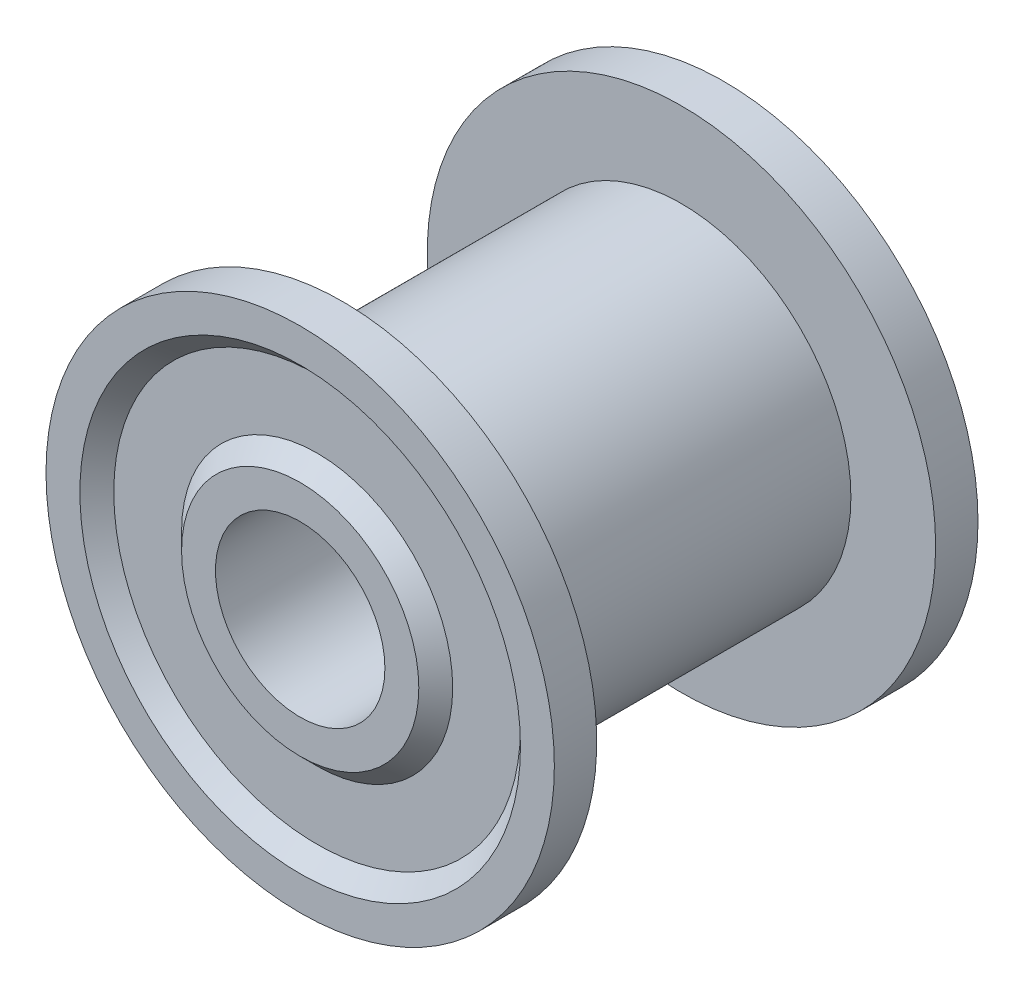
ISO-10303-21;
HEADER;
FILE_DESCRIPTION(('STEP AP214'),'2;1');
FILE_NAME('part.step','',(''),(''),'','','');
FILE_SCHEMA(('AUTOMOTIVE_DESIGN { 1 0 10303 214 1 1 1 1 }'));
ENDSEC;
DATA;
#1=APPLICATION_CONTEXT('core data for automotive mechanical design processes');
#2=APPLICATION_PROTOCOL_DEFINITION('international standard','automotive_design',2000,#1);
#3=PRODUCT_CONTEXT('',#1,'mechanical');
#4=PRODUCT('Part','Part','',(#3));
#5=PRODUCT_RELATED_PRODUCT_CATEGORY('part','',(#4));
#6=PRODUCT_DEFINITION_FORMATION('','',#4);
#7=PRODUCT_DEFINITION_CONTEXT('part definition',#1,'design');
#8=PRODUCT_DEFINITION('design','',#6,#7);
#9=PRODUCT_DEFINITION_SHAPE('','',#8);
#10=(LENGTH_UNIT() NAMED_UNIT(*) SI_UNIT(.MILLI.,.METRE.));
#11=(NAMED_UNIT(*) PLANE_ANGLE_UNIT() SI_UNIT($,.RADIAN.));
#12=(NAMED_UNIT(*) SI_UNIT($,.STERADIAN.) SOLID_ANGLE_UNIT());
#13=UNCERTAINTY_MEASURE_WITH_UNIT(LENGTH_MEASURE(1.E-05),#10,'distance_accuracy_value','');
#14=(GEOMETRIC_REPRESENTATION_CONTEXT(3) GLOBAL_UNCERTAINTY_ASSIGNED_CONTEXT((#13)) GLOBAL_UNIT_ASSIGNED_CONTEXT((#10,
#11,#12)) REPRESENTATION_CONTEXT('',''));
#15=CARTESIAN_POINT('',(0.,0.,0.));
#16=DIRECTION('',(0.,0.,1.));
#17=DIRECTION('',(1.,0.,0.));
#18=AXIS2_PLACEMENT_3D('',#15,#16,#17);
#19=CARTESIAN_POINT('',(0.,0.,0.));
#20=DIRECTION('',(0.,0.,1.));
#21=DIRECTION('',(1.,0.,0.));
#22=AXIS2_PLACEMENT_3D('',#19,#20,#21);
#23=PLANE('',#22);
#24=CARTESIAN_POINT('',(0.,0.,0.));
#25=DIRECTION('',(0.,0.,1.));
#26=DIRECTION('',(1.,0.,0.));
#27=AXIS2_PLACEMENT_3D('',#24,#25,#26);
#28=CIRCLE('',#27,5.);
#29=CARTESIAN_POINT('',(5.,0.,0.));
#30=VERTEX_POINT('',#29);
#31=EDGE_CURVE('E58',#30,#30,#28,.T.);
#32=ORIENTED_EDGE('',*,*,#31,.T.);
#33=EDGE_LOOP('',(#32));
#34=FACE_BOUND('',#33,.T.);
#35=CARTESIAN_POINT('',(0.,0.,0.));
#36=DIRECTION('',(0.,0.,1.));
#37=DIRECTION('',(1.,0.,0.));
#38=AXIS2_PLACEMENT_3D('',#35,#36,#37);
#39=CIRCLE('',#38,7.);
#40=CARTESIAN_POINT('',(7.,0.,0.));
#41=VERTEX_POINT('',#40);
#42=EDGE_CURVE('E87',#41,#41,#39,.T.);
#43=ORIENTED_EDGE('',*,*,#42,.F.);
#44=EDGE_LOOP('',(#43));
#45=FACE_BOUND('',#44,.T.);
#46=ADVANCED_FACE('F34',(#34,#45),#23,.F.);
#47=CARTESIAN_POINT('',(0.,0.,25.));
#48=DIRECTION('',(0.,0.,1.));
#49=DIRECTION('',(1.,0.,0.));
#50=AXIS2_PLACEMENT_3D('',#47,#48,#49);
#51=PLANE('',#50);
#52=CARTESIAN_POINT('',(0.,0.,25.));
#53=DIRECTION('',(0.,0.,1.));
#54=DIRECTION('',(1.,0.,0.));
#55=AXIS2_PLACEMENT_3D('',#52,#53,#54);
#56=CIRCLE('',#55,5.);
#57=CARTESIAN_POINT('',(5.,0.,25.));
#58=VERTEX_POINT('',#57);
#59=EDGE_CURVE('E66',#58,#58,#56,.T.);
#60=ORIENTED_EDGE('',*,*,#59,.F.);
#61=EDGE_LOOP('',(#60));
#62=FACE_BOUND('',#61,.T.);
#63=CARTESIAN_POINT('',(0.,0.,25.));
#64=DIRECTION('',(0.,0.,1.));
#65=DIRECTION('',(1.,0.,0.));
#66=AXIS2_PLACEMENT_3D('',#63,#64,#65);
#67=CIRCLE('',#66,7.);
#68=CARTESIAN_POINT('',(7.,0.,25.));
#69=VERTEX_POINT('',#68);
#70=EDGE_CURVE('E81',#69,#69,#67,.T.);
#71=ORIENTED_EDGE('',*,*,#70,.T.);
#72=EDGE_LOOP('',(#71));
#73=FACE_BOUND('',#72,.T.);
#74=ADVANCED_FACE('F94',(#62,#73),#51,.T.);
#75=CARTESIAN_POINT('',(0.,0.,25.));
#76=DIRECTION('',(0.,0.,-1.));
#77=DIRECTION('',(-1.,0.,0.));
#78=AXIS2_PLACEMENT_3D('',#75,#76,#77);
#79=CYLINDRICAL_SURFACE('',#78,15.);
#80=CARTESIAN_POINT('',(0.,0.,25.));
#81=DIRECTION('',(0.,0.,1.));
#82=DIRECTION('',(1.,0.,0.));
#83=AXIS2_PLACEMENT_3D('',#80,#81,#82);
#84=CIRCLE('',#83,15.);
#85=CARTESIAN_POINT('',(15.,0.,25.));
#86=VERTEX_POINT('',#85);
#87=EDGE_CURVE('E54',#86,#86,#84,.T.);
#88=ORIENTED_EDGE('',*,*,#87,.F.);
#89=EDGE_LOOP('',(#88));
#90=FACE_BOUND('',#89,.T.);
#91=CARTESIAN_POINT('',(0.,0.,22.5));
#92=DIRECTION('',(0.,0.,-1.));
#93=DIRECTION('',(-1.,0.,0.));
#94=AXIS2_PLACEMENT_3D('',#91,#92,#93);
#95=CIRCLE('',#94,15.);
#96=CARTESIAN_POINT('',(-15.,0.,22.5));
#97=VERTEX_POINT('',#96);
#98=EDGE_CURVE('E55',#97,#97,#95,.T.);
#99=ORIENTED_EDGE('',*,*,#98,.F.);
#100=EDGE_LOOP('',(#99));
#101=FACE_BOUND('',#100,.T.);
#102=ADVANCED_FACE('F101',(#90,#101),#79,.T.);
#103=CARTESIAN_POINT('',(0.,0.,0.));
#104=DIRECTION('',(0.,0.,1.));
#105=DIRECTION('',(1.,0.,0.));
#106=AXIS2_PLACEMENT_3D('',#103,#104,#105);
#107=CIRCLE('',#106,15.);
#108=CARTESIAN_POINT('',(15.,0.,0.));
#109=VERTEX_POINT('',#108);
#110=EDGE_CURVE('E63',#109,#109,#107,.T.);
#111=ORIENTED_EDGE('',*,*,#110,.T.);
#112=EDGE_LOOP('',(#111));
#113=FACE_BOUND('',#112,.T.);
#114=CARTESIAN_POINT('',(0.,0.,2.5));
#115=DIRECTION('',(0.,0.,1.));
#116=DIRECTION('',(1.,0.,0.));
#117=AXIS2_PLACEMENT_3D('',#114,#115,#116);
#118=CIRCLE('',#117,15.);
#119=CARTESIAN_POINT('',(15.,0.,2.5));
#120=VERTEX_POINT('',#119);
#121=EDGE_CURVE('E59',#120,#120,#118,.T.);
#122=ORIENTED_EDGE('',*,*,#121,.F.);
#123=EDGE_LOOP('',(#122));
#124=FACE_BOUND('',#123,.T.);
#125=ADVANCED_FACE('F116',(#113,#124),#79,.T.);
#126=CARTESIAN_POINT('',(0.,0.,25.));
#127=DIRECTION('',(0.,0.,1.));
#128=DIRECTION('',(1.,0.,0.));
#129=AXIS2_PLACEMENT_3D('',#126,#127,#128);
#130=CIRCLE('',#129,13.);
#131=CARTESIAN_POINT('',(13.,0.,25.));
#132=VERTEX_POINT('',#131);
#133=EDGE_CURVE('E78',#132,#132,#130,.T.);
#134=ORIENTED_EDGE('',*,*,#133,.F.);
#135=EDGE_LOOP('',(#134));
#136=FACE_BOUND('',#135,.T.);
#137=ORIENTED_EDGE('',*,*,#87,.T.);
#138=EDGE_LOOP('',(#137));
#139=FACE_BOUND('',#138,.T.);
#140=ADVANCED_FACE('F104',(#136,#139),#51,.T.);
#141=CARTESIAN_POINT('',(0.,0.,0.));
#142=DIRECTION('',(0.,0.,1.));
#143=DIRECTION('',(1.,0.,0.));
#144=AXIS2_PLACEMENT_3D('',#141,#142,#143);
#145=CIRCLE('',#144,13.);
#146=CARTESIAN_POINT('',(13.,0.,0.));
#147=VERTEX_POINT('',#146);
#148=EDGE_CURVE('E84',#147,#147,#145,.T.);
#149=ORIENTED_EDGE('',*,*,#148,.T.);
#150=EDGE_LOOP('',(#149));
#151=FACE_BOUND('',#150,.T.);
#152=ORIENTED_EDGE('',*,*,#110,.F.);
#153=EDGE_LOOP('',(#152));
#154=FACE_BOUND('',#153,.T.);
#155=ADVANCED_FACE('F97',(#151,#154),#23,.F.);
#156=CARTESIAN_POINT('',(0.,0.,25.));
#157=DIRECTION('',(0.,0.,-1.));
#158=DIRECTION('',(-1.,0.,0.));
#159=AXIS2_PLACEMENT_3D('',#156,#157,#158);
#160=CYLINDRICAL_SURFACE('',#159,5.);
#161=ORIENTED_EDGE('',*,*,#59,.T.);
#162=EDGE_LOOP('',(#161));
#163=FACE_BOUND('',#162,.T.);
#164=ORIENTED_EDGE('',*,*,#31,.F.);
#165=EDGE_LOOP('',(#164));
#166=FACE_BOUND('',#165,.T.);
#167=ADVANCED_FACE('F107',(#163,#166),#160,.F.);
#168=CARTESIAN_POINT('',(0.,10.,22.5));
#169=DIRECTION('',(0.,0.,-1.));
#170=DIRECTION('',(-1.,0.,0.));
#171=AXIS2_PLACEMENT_3D('',#168,#169,#170);
#172=PLANE('',#171);
#173=CARTESIAN_POINT('',(0.,0.,22.5));
#174=DIRECTION('',(0.,0.,1.));
#175=DIRECTION('',(1.,0.,0.));
#176=AXIS2_PLACEMENT_3D('',#173,#174,#175);
#177=CIRCLE('',#176,10.);
#178=CARTESIAN_POINT('',(10.,0.,22.5));
#179=VERTEX_POINT('',#178);
#180=EDGE_CURVE('E62',#179,#179,#177,.T.);
#181=ORIENTED_EDGE('',*,*,#180,.T.);
#182=EDGE_LOOP('',(#181));
#183=FACE_BOUND('',#182,.T.);
#184=ORIENTED_EDGE('',*,*,#98,.T.);
#185=EDGE_LOOP('',(#184));
#186=FACE_BOUND('',#185,.T.);
#187=ADVANCED_FACE('F113',(#183,#186),#172,.T.);
#188=CARTESIAN_POINT('',(0.,10.,2.5));
#189=DIRECTION('',(0.,0.,1.));
#190=DIRECTION('',(1.,0.,0.));
#191=AXIS2_PLACEMENT_3D('',#188,#189,#190);
#192=PLANE('',#191);
#193=CARTESIAN_POINT('',(0.,0.,2.5));
#194=DIRECTION('',(0.,0.,1.));
#195=DIRECTION('',(1.,0.,0.));
#196=AXIS2_PLACEMENT_3D('',#193,#194,#195);
#197=CIRCLE('',#196,10.);
#198=CARTESIAN_POINT('',(10.,0.,2.5));
#199=VERTEX_POINT('',#198);
#200=EDGE_CURVE('E75',#199,#199,#197,.T.);
#201=ORIENTED_EDGE('',*,*,#200,.F.);
#202=EDGE_LOOP('',(#201));
#203=FACE_BOUND('',#202,.T.);
#204=ORIENTED_EDGE('',*,*,#121,.T.);
#205=EDGE_LOOP('',(#204));
#206=FACE_BOUND('',#205,.T.);
#207=ADVANCED_FACE('F126',(#203,#206),#192,.T.);
#208=CARTESIAN_POINT('',(0.,0.,25.));
#209=DIRECTION('',(0.,0.,1.));
#210=DIRECTION('',(1.,0.,0.));
#211=AXIS2_PLACEMENT_3D('',#208,#209,#210);
#212=CYLINDRICAL_SURFACE('',#211,10.);
#213=ORIENTED_EDGE('',*,*,#200,.T.);
#214=EDGE_LOOP('',(#213));
#215=FACE_BOUND('',#214,.T.);
#216=ORIENTED_EDGE('',*,*,#180,.F.);
#217=EDGE_LOOP('',(#216));
#218=FACE_BOUND('',#217,.T.);
#219=ADVANCED_FACE('F128',(#215,#218),#212,.T.);
#220=CARTESIAN_POINT('',(0.,0.,24.));
#221=DIRECTION('',(0.,0.,1.));
#222=DIRECTION('',(1.,0.,0.));
#223=AXIS2_PLACEMENT_3D('',#220,#221,#222);
#224=PLANE('',#223);
#225=CARTESIAN_POINT('',(0.,0.,24.));
#226=DIRECTION('',(0.,0.,1.));
#227=DIRECTION('',(1.,0.,0.));
#228=AXIS2_PLACEMENT_3D('',#225,#226,#227);
#229=CIRCLE('',#228,12.);
#230=CARTESIAN_POINT('',(12.,0.,24.));
#231=VERTEX_POINT('',#230);
#232=EDGE_CURVE('E45',#231,#231,#229,.T.);
#233=ORIENTED_EDGE('',*,*,#232,.T.);
#234=EDGE_LOOP('',(#233));
#235=FACE_BOUND('',#234,.T.);
#236=CARTESIAN_POINT('',(0.,0.,24.));
#237=DIRECTION('',(0.,0.,1.));
#238=DIRECTION('',(1.,0.,0.));
#239=AXIS2_PLACEMENT_3D('',#236,#237,#238);
#240=CIRCLE('',#239,7.99999999999999);
#241=CARTESIAN_POINT('',(7.99999999999999,0.,24.));
#242=VERTEX_POINT('',#241);
#243=EDGE_CURVE('E49',#242,#242,#240,.F.);
#244=ORIENTED_EDGE('',*,*,#243,.T.);
#245=EDGE_LOOP('',(#244));
#246=FACE_BOUND('',#245,.T.);
#247=ADVANCED_FACE('F135',(#235,#246),#224,.T.);
#248=CARTESIAN_POINT('',(0.,0.,24.));
#249=DIRECTION('',(0.,0.,1.));
#250=DIRECTION('',(1.,0.,0.));
#251=AXIS2_PLACEMENT_3D('',#248,#249,#250);
#252=CONICAL_SURFACE('',#251,12.,0.785398163397449);
#253=ORIENTED_EDGE('',*,*,#133,.T.);
#254=EDGE_LOOP('',(#253));
#255=FACE_BOUND('',#254,.T.);
#256=ORIENTED_EDGE('',*,*,#232,.F.);
#257=EDGE_LOOP('',(#256));
#258=FACE_BOUND('',#257,.T.);
#259=ADVANCED_FACE('F144',(#255,#258),#252,.F.);
#260=CARTESIAN_POINT('',(0.,0.,25.));
#261=DIRECTION('',(0.,0.,-1.));
#262=DIRECTION('',(-1.,0.,0.));
#263=AXIS2_PLACEMENT_3D('',#260,#261,#262);
#264=CONICAL_SURFACE('',#263,7.,0.785398163397444);
#265=ORIENTED_EDGE('',*,*,#243,.F.);
#266=EDGE_LOOP('',(#265));
#267=FACE_BOUND('',#266,.T.);
#268=ORIENTED_EDGE('',*,*,#70,.F.);
#269=EDGE_LOOP('',(#268));
#270=FACE_BOUND('',#269,.T.);
#271=ADVANCED_FACE('F149',(#267,#270),#264,.T.);
#272=CARTESIAN_POINT('',(0.,0.,1.));
#273=DIRECTION('',(0.,0.,-1.));
#274=DIRECTION('',(1.,0.,0.));
#275=AXIS2_PLACEMENT_3D('',#272,#273,#274);
#276=PLANE('',#275);
#277=CARTESIAN_POINT('',(0.,0.,1.));
#278=DIRECTION('',(0.,0.,-1.));
#279=DIRECTION('',(-1.,0.,0.));
#280=AXIS2_PLACEMENT_3D('',#277,#278,#279);
#281=CIRCLE('',#280,12.);
#282=CARTESIAN_POINT('',(-12.,0.,1.));
#283=VERTEX_POINT('',#282);
#284=EDGE_CURVE('E10',#283,#283,#281,.T.);
#285=ORIENTED_EDGE('',*,*,#284,.T.);
#286=EDGE_LOOP('',(#285));
#287=FACE_BOUND('',#286,.T.);
#288=CARTESIAN_POINT('',(0.,0.,1.));
#289=DIRECTION('',(0.,0.,-1.));
#290=DIRECTION('',(-1.,0.,0.));
#291=AXIS2_PLACEMENT_3D('',#288,#289,#290);
#292=CIRCLE('',#291,8.00000000000002);
#293=CARTESIAN_POINT('',(-8.00000000000002,0.,1.));
#294=VERTEX_POINT('',#293);
#295=EDGE_CURVE('E41',#294,#294,#292,.F.);
#296=ORIENTED_EDGE('',*,*,#295,.T.);
#297=EDGE_LOOP('',(#296));
#298=FACE_BOUND('',#297,.T.);
#299=ADVANCED_FACE('F146',(#287,#298),#276,.T.);
#300=CARTESIAN_POINT('',(0.,0.,0.));
#301=DIRECTION('',(0.,0.,-1.));
#302=DIRECTION('',(-1.,0.,0.));
#303=AXIS2_PLACEMENT_3D('',#300,#301,#302);
#304=CONICAL_SURFACE('',#303,13.,0.785398163397443);
#305=ORIENTED_EDGE('',*,*,#284,.F.);
#306=EDGE_LOOP('',(#305));
#307=FACE_BOUND('',#306,.T.);
#308=ORIENTED_EDGE('',*,*,#148,.F.);
#309=EDGE_LOOP('',(#308));
#310=FACE_BOUND('',#309,.T.);
#311=ADVANCED_FACE('F148',(#307,#310),#304,.F.);
#312=CARTESIAN_POINT('',(0.,0.,1.));
#313=DIRECTION('',(0.,0.,1.));
#314=DIRECTION('',(1.,0.,0.));
#315=AXIS2_PLACEMENT_3D('',#312,#313,#314);
#316=CONICAL_SURFACE('',#315,8.00000000000002,0.785398163397453);
#317=ORIENTED_EDGE('',*,*,#42,.T.);
#318=EDGE_LOOP('',(#317));
#319=FACE_BOUND('',#318,.T.);
#320=ORIENTED_EDGE('',*,*,#295,.F.);
#321=EDGE_LOOP('',(#320));
#322=FACE_BOUND('',#321,.T.);
#323=ADVANCED_FACE('F36',(#319,#322),#316,.T.);
#324=CLOSED_SHELL('',(#46,#74,#102,#125,#140,#155,#167,#187,#207,#219,#247,#259,#271,#299,#311,#323));
#325=MANIFOLD_SOLID_BREP('B2',#324);
#326=ADVANCED_BREP_SHAPE_REPRESENTATION('',(#18,#325),#14);
#327=SHAPE_DEFINITION_REPRESENTATION(#9,#326);
ENDSEC;
END-ISO-10303-21;
